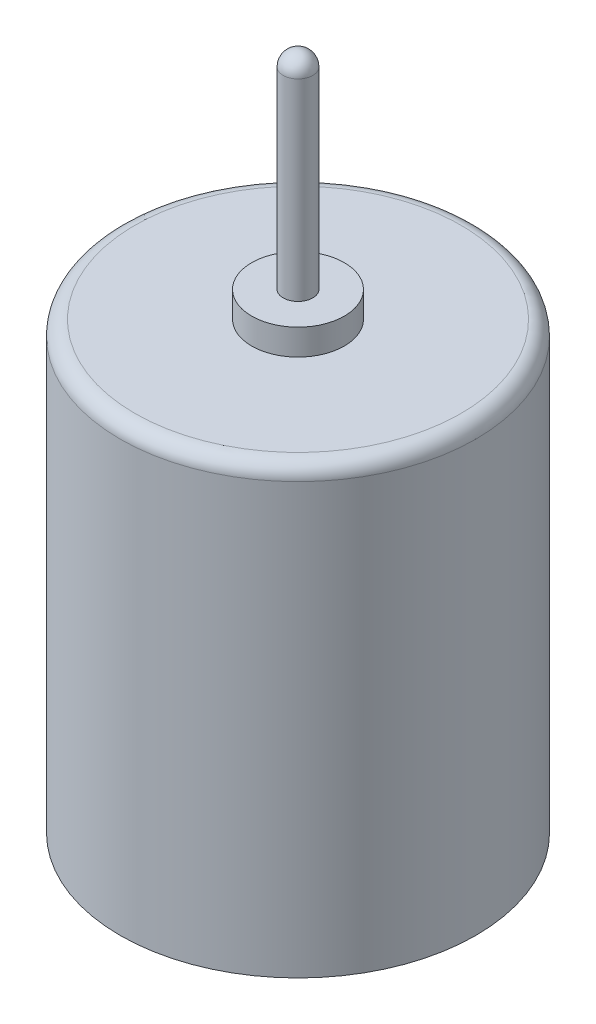
ISO-10303-21;
HEADER;
FILE_DESCRIPTION(('STEP AP214'),'2;1');
FILE_NAME('part.step','',(''),(''),'','','');
FILE_SCHEMA(('AUTOMOTIVE_DESIGN { 1 0 10303 214 1 1 1 1 }'));
ENDSEC;
DATA;
#1=APPLICATION_CONTEXT('core data for automotive mechanical design processes');
#2=APPLICATION_PROTOCOL_DEFINITION('international standard','automotive_design',2000,#1);
#3=PRODUCT_CONTEXT('',#1,'mechanical');
#4=PRODUCT('Part','Part','',(#3));
#5=PRODUCT_RELATED_PRODUCT_CATEGORY('part','',(#4));
#6=PRODUCT_DEFINITION_FORMATION('','',#4);
#7=PRODUCT_DEFINITION_CONTEXT('part definition',#1,'design');
#8=PRODUCT_DEFINITION('design','',#6,#7);
#9=PRODUCT_DEFINITION_SHAPE('','',#8);
#10=(LENGTH_UNIT() NAMED_UNIT(*) SI_UNIT(.MILLI.,.METRE.));
#11=(NAMED_UNIT(*) PLANE_ANGLE_UNIT() SI_UNIT($,.RADIAN.));
#12=(NAMED_UNIT(*) SI_UNIT($,.STERADIAN.) SOLID_ANGLE_UNIT());
#13=UNCERTAINTY_MEASURE_WITH_UNIT(LENGTH_MEASURE(1.E-05),#10,'distance_accuracy_value','');
#14=(GEOMETRIC_REPRESENTATION_CONTEXT(3) GLOBAL_UNCERTAINTY_ASSIGNED_CONTEXT((#13)) GLOBAL_UNIT_ASSIGNED_CONTEXT((#10,
#11,#12)) REPRESENTATION_CONTEXT('',''));
#15=CARTESIAN_POINT('',(0.,0.,0.));
#16=DIRECTION('',(0.,0.,1.));
#17=DIRECTION('',(1.,0.,0.));
#18=AXIS2_PLACEMENT_3D('',#15,#16,#17);
#19=CARTESIAN_POINT('',(0.,30.48,0.));
#20=DIRECTION('',(0.,-1.,0.));
#21=DIRECTION('',(0.,0.,-1.));
#22=AXIS2_PLACEMENT_3D('',#19,#20,#21);
#23=CYLINDRICAL_SURFACE('',#22,12.192);
#24=CARTESIAN_POINT('',(0.,29.464,0.));
#25=DIRECTION('',(0.,1.,0.));
#26=DIRECTION('',(0.,0.,1.));
#27=AXIS2_PLACEMENT_3D('',#24,#25,#26);
#28=CIRCLE('',#27,12.192);
#29=CARTESIAN_POINT('',(0.,29.464,-12.192));
#30=VERTEX_POINT('',#29);
#31=EDGE_CURVE('E10',#30,#30,#28,.F.);
#32=CARTESIAN_POINT('',(0.,0.,0.));
#33=DIRECTION('',(0.,1.,0.));
#34=DIRECTION('',(0.,0.,1.));
#35=AXIS2_PLACEMENT_3D('',#32,#33,#34);
#36=CIRCLE('',#35,12.192);
#37=CARTESIAN_POINT('',(0.,0.,-12.192));
#38=VERTEX_POINT('',#37);
#39=EDGE_CURVE('E54',#38,#38,#36,.T.);
#40=CARTESIAN_POINT('',(0.,29.464,-12.192));
#41=CARTESIAN_POINT('',(0.,29.1570833333333,-12.192));
#42=CARTESIAN_POINT('',(0.,28.8501666666667,-12.192));
#43=CARTESIAN_POINT('',(0.,28.2363333333333,-12.192));
#44=CARTESIAN_POINT('',(0.,27.9294166666667,-12.192));
#45=CARTESIAN_POINT('',(0.,27.3155833333333,-12.192));
#46=CARTESIAN_POINT('',(0.,27.0086666666667,-12.192));
#47=CARTESIAN_POINT('',(0.,26.3948333333333,-12.192));
#48=CARTESIAN_POINT('',(0.,26.0879166666667,-12.192));
#49=CARTESIAN_POINT('',(0.,25.4740833333333,-12.192));
#50=CARTESIAN_POINT('',(0.,25.1671666666667,-12.192));
#51=CARTESIAN_POINT('',(0.,24.5533333333333,-12.192));
#52=CARTESIAN_POINT('',(0.,24.2464166666667,-12.192));
#53=CARTESIAN_POINT('',(0.,23.6325833333333,-12.192));
#54=CARTESIAN_POINT('',(0.,23.3256666666667,-12.192));
#55=CARTESIAN_POINT('',(0.,22.7118333333333,-12.192));
#56=CARTESIAN_POINT('',(0.,22.4049166666667,-12.192));
#57=CARTESIAN_POINT('',(0.,21.7910833333333,-12.192));
#58=CARTESIAN_POINT('',(0.,21.4841666666667,-12.192));
#59=CARTESIAN_POINT('',(0.,20.8703333333333,-12.192));
#60=CARTESIAN_POINT('',(0.,20.5634166666667,-12.192));
#61=CARTESIAN_POINT('',(0.,19.9495833333333,-12.192));
#62=CARTESIAN_POINT('',(0.,19.6426666666667,-12.192));
#63=CARTESIAN_POINT('',(0.,19.0288333333333,-12.192));
#64=CARTESIAN_POINT('',(0.,18.7219166666667,-12.192));
#65=CARTESIAN_POINT('',(0.,18.1080833333333,-12.192));
#66=CARTESIAN_POINT('',(0.,17.8011666666667,-12.192));
#67=CARTESIAN_POINT('',(0.,17.1873333333333,-12.192));
#68=CARTESIAN_POINT('',(0.,16.8804166666667,-12.192));
#69=CARTESIAN_POINT('',(0.,16.2665833333333,-12.192));
#70=CARTESIAN_POINT('',(0.,15.9596666666667,-12.192));
#71=CARTESIAN_POINT('',(0.,15.3458333333333,-12.192));
#72=CARTESIAN_POINT('',(0.,15.0389166666667,-12.192));
#73=CARTESIAN_POINT('',(0.,14.4250833333333,-12.192));
#74=CARTESIAN_POINT('',(0.,14.1181666666667,-12.192));
#75=CARTESIAN_POINT('',(0.,13.5043333333333,-12.192));
#76=CARTESIAN_POINT('',(0.,13.1974166666667,-12.192));
#77=CARTESIAN_POINT('',(0.,12.5835833333333,-12.192));
#78=CARTESIAN_POINT('',(0.,12.2766666666667,-12.192));
#79=CARTESIAN_POINT('',(0.,11.6628333333333,-12.192));
#80=CARTESIAN_POINT('',(0.,11.3559166666667,-12.192));
#81=CARTESIAN_POINT('',(0.,10.7420833333333,-12.192));
#82=CARTESIAN_POINT('',(0.,10.4351666666667,-12.192));
#83=CARTESIAN_POINT('',(0.,9.82133333333333,-12.192));
#84=CARTESIAN_POINT('',(0.,9.51441666666667,-12.192));
#85=CARTESIAN_POINT('',(0.,8.90058333333333,-12.192));
#86=CARTESIAN_POINT('',(0.,8.59366666666667,-12.192));
#87=CARTESIAN_POINT('',(0.,7.97983333333333,-12.192));
#88=CARTESIAN_POINT('',(0.,7.67291666666666,-12.192));
#89=CARTESIAN_POINT('',(0.,7.05908333333333,-12.192));
#90=CARTESIAN_POINT('',(0.,6.75216666666667,-12.192));
#91=CARTESIAN_POINT('',(0.,6.13833333333333,-12.192));
#92=CARTESIAN_POINT('',(0.,5.83141666666666,-12.192));
#93=CARTESIAN_POINT('',(0.,5.21758333333333,-12.192));
#94=CARTESIAN_POINT('',(0.,4.91066666666667,-12.192));
#95=CARTESIAN_POINT('',(0.,4.29683333333333,-12.192));
#96=CARTESIAN_POINT('',(0.,3.98991666666667,-12.192));
#97=CARTESIAN_POINT('',(0.,3.37608333333333,-12.192));
#98=CARTESIAN_POINT('',(0.,3.06916666666667,-12.192));
#99=CARTESIAN_POINT('',(0.,2.45533333333333,-12.192));
#100=CARTESIAN_POINT('',(0.,2.14841666666667,-12.192));
#101=CARTESIAN_POINT('',(0.,1.53458333333333,-12.192));
#102=CARTESIAN_POINT('',(0.,1.22766666666667,-12.192));
#103=CARTESIAN_POINT('',(0.,0.613833333333334,-12.192));
#104=CARTESIAN_POINT('',(0.,0.306916666666667,-12.192));
#105=CARTESIAN_POINT('',(0.,0.,-12.192));
#106=B_SPLINE_CURVE_WITH_KNOTS('',3,(#40,#41,#42,#43,#44,#45,#46,#47,#48,#49,#50,#51,#52,#53,
#54,#55,#56,#57,#58,#59,#60,#61,#62,#63,#64,#65,#66,#67,#68,#69,#70,#71,#72,#73,#74,#75,#76,#77,
#78,#79,#80,#81,#82,#83,#84,#85,#86,#87,#88,#89,#90,#91,#92,#93,#94,#95,#96,#97,#98,#99,#100,
#101,#102,#103,#104,#105),.UNSPECIFIED.,.F.,.F.,(4,2,2,2,2,2,2,2,2,2,2,2,2,2,2,2,2,2,2,2,2,2,2,
2,2,2,2,2,2,2,2,2,4),(0.,0.920749999999998,1.8415,2.76225,3.683,4.60375,5.5245,6.44525,
7.36599999999999,8.28675,9.2075,10.12825,11.049,11.96975,12.8905,13.81125,14.732,15.65275,
16.5735,17.49425,18.415,19.33575,20.2565,21.17725,22.098,23.01875,23.9395,24.86025,25.781,
26.70175,27.6225,28.54325,29.464),.UNSPECIFIED.);
#107=EDGE_CURVE('BSEAM36',#30,#38,#106,.T.);
#108=ORIENTED_EDGE('',*,*,#31,.T.);
#109=ORIENTED_EDGE('',*,*,#39,.T.);
#110=ORIENTED_EDGE('',*,*,#107,.T.);
#111=ORIENTED_EDGE('',*,*,#107,.F.);
#112=EDGE_LOOP('',(#108,#110,#109,#111));
#113=FACE_BOUND('',#112,.T.);
#114=ADVANCED_FACE('F36',(#113),#23,.T.);
#115=CARTESIAN_POINT('',(0.,30.48,0.));
#116=DIRECTION('',(0.,1.,0.));
#117=DIRECTION('',(0.,0.,1.));
#118=AXIS2_PLACEMENT_3D('',#115,#116,#117);
#119=PLANE('',#118);
#120=CARTESIAN_POINT('',(0.,30.48,0.));
#121=DIRECTION('',(0.,1.,0.));
#122=DIRECTION('',(0.,0.,1.));
#123=AXIS2_PLACEMENT_3D('',#120,#121,#122);
#124=CIRCLE('',#123,11.176);
#125=CARTESIAN_POINT('',(0.,30.48,11.176));
#126=VERTEX_POINT('',#125);
#127=EDGE_CURVE('E43',#126,#126,#124,.T.);
#128=ORIENTED_EDGE('',*,*,#127,.T.);
#129=EDGE_LOOP('',(#128));
#130=FACE_BOUND('',#129,.T.);
#131=CARTESIAN_POINT('',(0.,30.48,0.));
#132=DIRECTION('',(0.,1.,0.));
#133=DIRECTION('',(0.,0.,1.));
#134=AXIS2_PLACEMENT_3D('',#131,#132,#133);
#135=CIRCLE('',#134,3.175);
#136=CARTESIAN_POINT('',(0.,30.48,3.175));
#137=VERTEX_POINT('',#136);
#138=EDGE_CURVE('E57',#137,#137,#135,.T.);
#139=ORIENTED_EDGE('',*,*,#138,.F.);
#140=EDGE_LOOP('',(#139));
#141=FACE_BOUND('',#140,.T.);
#142=ADVANCED_FACE('F81',(#130,#141),#119,.T.);
#143=CARTESIAN_POINT('',(0.,0.,0.));
#144=DIRECTION('',(0.,1.,0.));
#145=DIRECTION('',(0.,0.,1.));
#146=AXIS2_PLACEMENT_3D('',#143,#144,#145);
#147=PLANE('',#146);
#148=ORIENTED_EDGE('',*,*,#39,.F.);
#149=EDGE_LOOP('',(#148));
#150=FACE_BOUND('',#149,.T.);
#151=ADVANCED_FACE('F77',(#150),#147,.F.);
#152=CARTESIAN_POINT('',(0.,32.258,0.));
#153=DIRECTION('',(0.,-1.,0.));
#154=DIRECTION('',(0.,0.,-1.));
#155=AXIS2_PLACEMENT_3D('',#152,#153,#154);
#156=CYLINDRICAL_SURFACE('',#155,3.175);
#157=CARTESIAN_POINT('',(0.,32.258,0.));
#158=DIRECTION('',(0.,1.,0.));
#159=DIRECTION('',(0.,0.,1.));
#160=AXIS2_PLACEMENT_3D('',#157,#158,#159);
#161=CIRCLE('',#160,3.175);
#162=CARTESIAN_POINT('',(0.,32.258,3.175));
#163=VERTEX_POINT('',#162);
#164=EDGE_CURVE('E58',#163,#163,#161,.T.);
#165=ORIENTED_EDGE('',*,*,#164,.F.);
#166=EDGE_LOOP('',(#165));
#167=FACE_BOUND('',#166,.T.);
#168=ORIENTED_EDGE('',*,*,#138,.T.);
#169=EDGE_LOOP('',(#168));
#170=FACE_BOUND('',#169,.T.);
#171=ADVANCED_FACE('F71',(#167,#170),#156,.T.);
#172=CARTESIAN_POINT('',(0.,32.258,0.));
#173=DIRECTION('',(0.,1.,0.));
#174=DIRECTION('',(0.,0.,1.));
#175=AXIS2_PLACEMENT_3D('',#172,#173,#174);
#176=PLANE('',#175);
#177=CARTESIAN_POINT('',(0.,32.258,0.));
#178=DIRECTION('',(0.,1.,0.));
#179=DIRECTION('',(0.,0.,1.));
#180=AXIS2_PLACEMENT_3D('',#177,#178,#179);
#181=CIRCLE('',#180,1.016);
#182=CARTESIAN_POINT('',(0.,32.258,1.016));
#183=VERTEX_POINT('',#182);
#184=EDGE_CURVE('E51',#183,#183,#181,.T.);
#185=ORIENTED_EDGE('',*,*,#184,.F.);
#186=EDGE_LOOP('',(#185));
#187=FACE_BOUND('',#186,.T.);
#188=ORIENTED_EDGE('',*,*,#164,.T.);
#189=EDGE_LOOP('',(#188));
#190=FACE_BOUND('',#189,.T.);
#191=ADVANCED_FACE('F68',(#187,#190),#176,.T.);
#192=CARTESIAN_POINT('',(0.,46.482,0.));
#193=DIRECTION('',(0.,-1.,0.));
#194=DIRECTION('',(0.,0.,-1.));
#195=AXIS2_PLACEMENT_3D('',#192,#193,#194);
#196=CYLINDRICAL_SURFACE('',#195,1.016);
#197=CARTESIAN_POINT('',(0.,45.466,0.));
#198=DIRECTION('',(0.,-1.,0.));
#199=DIRECTION('',(0.,0.,-1.));
#200=AXIS2_PLACEMENT_3D('',#197,#198,#199);
#201=CIRCLE('',#200,1.016);
#202=CARTESIAN_POINT('',(0.,45.466,-1.016));
#203=VERTEX_POINT('',#202);
#204=EDGE_CURVE('E47',#203,#203,#201,.T.);
#205=ORIENTED_EDGE('',*,*,#204,.T.);
#206=EDGE_LOOP('',(#205));
#207=FACE_BOUND('',#206,.T.);
#208=ORIENTED_EDGE('',*,*,#184,.T.);
#209=EDGE_LOOP('',(#208));
#210=FACE_BOUND('',#209,.T.);
#211=ADVANCED_FACE('F66',(#207,#210),#196,.T.);
#212=CARTESIAN_POINT('',(0.,45.466,0.));
#213=DIRECTION('',(0.,1.,0.));
#214=DIRECTION('',(0.,0.,1.));
#215=AXIS2_PLACEMENT_3D('',#212,#213,#214);
#216=SPHERICAL_SURFACE('',#215,1.016);
#217=ORIENTED_EDGE('',*,*,#204,.F.);
#218=EDGE_LOOP('',(#217));
#219=FACE_BOUND('',#218,.T.);
#220=ADVANCED_FACE('F91',(#219),#216,.T.);
#221=CARTESIAN_POINT('',(0.,29.464,0.));
#222=DIRECTION('',(0.,1.,0.));
#223=DIRECTION('',(0.,0.,1.));
#224=AXIS2_PLACEMENT_3D('',#221,#222,#223);
#225=TOROIDAL_SURFACE('',#224,11.176,1.016);
#226=ORIENTED_EDGE('',*,*,#31,.F.);
#227=EDGE_LOOP('',(#226));
#228=FACE_BOUND('',#227,.T.);
#229=ORIENTED_EDGE('',*,*,#127,.F.);
#230=EDGE_LOOP('',(#229));
#231=FACE_BOUND('',#230,.T.);
#232=ADVANCED_FACE('F38',(#228,#231),#225,.T.);
#233=CLOSED_SHELL('',(#114,#142,#151,#171,#191,#211,#220,#232));
#234=MANIFOLD_SOLID_BREP('B2',#233);
#235=ADVANCED_BREP_SHAPE_REPRESENTATION('',(#18,#234),#14);
#236=SHAPE_DEFINITION_REPRESENTATION(#9,#235);
ENDSEC;
END-ISO-10303-21;
